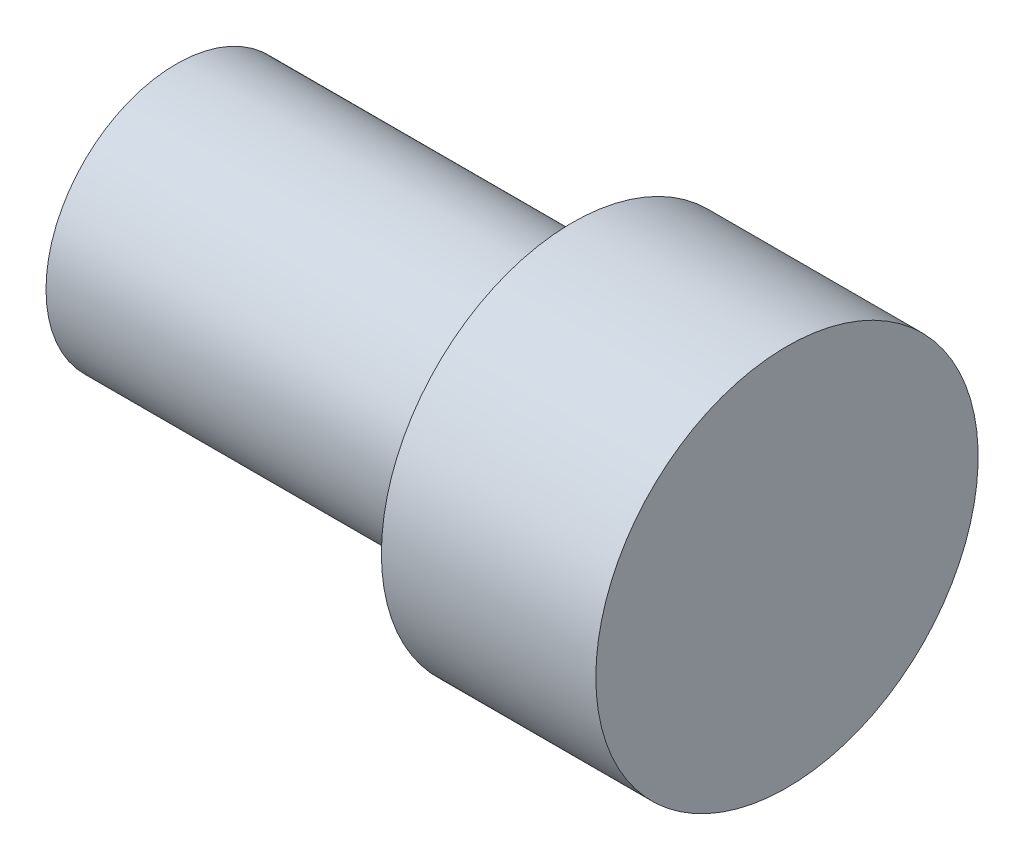
ISO-10303-21;
HEADER;
FILE_DESCRIPTION(('STEP AP214'),'2;1');
FILE_NAME('part.step','',(''),(''),'','','');
FILE_SCHEMA(('AUTOMOTIVE_DESIGN { 1 0 10303 214 1 1 1 1 }'));
ENDSEC;
DATA;
#1=APPLICATION_CONTEXT('core data for automotive mechanical design processes');
#2=APPLICATION_PROTOCOL_DEFINITION('international standard','automotive_design',2000,#1);
#3=PRODUCT_CONTEXT('',#1,'mechanical');
#4=PRODUCT('Part','Part','',(#3));
#5=PRODUCT_RELATED_PRODUCT_CATEGORY('part','',(#4));
#6=PRODUCT_DEFINITION_FORMATION('','',#4);
#7=PRODUCT_DEFINITION_CONTEXT('part definition',#1,'design');
#8=PRODUCT_DEFINITION('design','',#6,#7);
#9=PRODUCT_DEFINITION_SHAPE('','',#8);
#10=(LENGTH_UNIT() NAMED_UNIT(*) SI_UNIT(.MILLI.,.METRE.));
#11=(NAMED_UNIT(*) PLANE_ANGLE_UNIT() SI_UNIT($,.RADIAN.));
#12=(NAMED_UNIT(*) SI_UNIT($,.STERADIAN.) SOLID_ANGLE_UNIT());
#13=UNCERTAINTY_MEASURE_WITH_UNIT(LENGTH_MEASURE(1.E-05),#10,'distance_accuracy_value','');
#14=(GEOMETRIC_REPRESENTATION_CONTEXT(3) GLOBAL_UNCERTAINTY_ASSIGNED_CONTEXT((#13)) GLOBAL_UNIT_ASSIGNED_CONTEXT((#10,
#11,#12)) REPRESENTATION_CONTEXT('',''));
#15=CARTESIAN_POINT('',(0.,0.,0.));
#16=DIRECTION('',(0.,0.,1.));
#17=DIRECTION('',(1.,0.,0.));
#18=AXIS2_PLACEMENT_3D('',#15,#16,#17);
#19=CARTESIAN_POINT('',(-65.9159494636814,0.,0.));
#20=DIRECTION('',(1.,0.,0.));
#21=DIRECTION('',(0.,0.,-1.));
#22=AXIS2_PLACEMENT_3D('',#19,#20,#21);
#23=PLANE('',#22);
#24=CARTESIAN_POINT('',(-65.9159494636814,0.,0.));
#25=DIRECTION('',(-1.,0.,0.));
#26=DIRECTION('',(0.,0.,1.));
#27=AXIS2_PLACEMENT_3D('',#24,#25,#26);
#28=CIRCLE('',#27,28.0596335331635);
#29=CARTESIAN_POINT('',(-65.9159494636814,0.,28.0596335331635));
#30=VERTEX_POINT('',#29);
#31=EDGE_CURVE('E10',#30,#30,#28,.T.);
#32=ORIENTED_EDGE('',*,*,#31,.T.);
#33=EDGE_LOOP('',(#32));
#34=FACE_BOUND('',#33,.T.);
#35=ADVANCED_FACE('F33',(#34),#23,.F.);
#36=CARTESIAN_POINT('',(-65.9159494636814,0.,0.));
#37=DIRECTION('',(-1.,0.,0.));
#38=DIRECTION('',(0.,0.,1.));
#39=AXIS2_PLACEMENT_3D('',#36,#37,#38);
#40=CYLINDRICAL_SURFACE('',#39,28.0596335331635);
#41=ORIENTED_EDGE('',*,*,#31,.F.);
#42=EDGE_LOOP('',(#41));
#43=FACE_BOUND('',#42,.T.);
#44=CARTESIAN_POINT('',(19.4724180984454,0.,0.));
#45=DIRECTION('',(-1.,0.,0.));
#46=DIRECTION('',(0.,0.,1.));
#47=AXIS2_PLACEMENT_3D('',#44,#45,#46);
#48=CIRCLE('',#47,28.0596335331635);
#49=CARTESIAN_POINT('',(19.4724180984454,0.,28.0596335331635));
#50=VERTEX_POINT('',#49);
#51=EDGE_CURVE('E39',#50,#50,#48,.T.);
#52=ORIENTED_EDGE('',*,*,#51,.T.);
#53=EDGE_LOOP('',(#52));
#54=FACE_BOUND('',#53,.T.);
#55=ADVANCED_FACE('F65',(#43,#54),#40,.T.);
#56=CARTESIAN_POINT('',(19.4724180984454,28.0596335331635,0.));
#57=DIRECTION('',(1.,0.,0.));
#58=DIRECTION('',(0.,0.,-1.));
#59=AXIS2_PLACEMENT_3D('',#56,#57,#58);
#60=PLANE('',#59);
#61=ORIENTED_EDGE('',*,*,#51,.F.);
#62=EDGE_LOOP('',(#61));
#63=FACE_BOUND('',#62,.T.);
#64=CARTESIAN_POINT('',(19.4724180984454,0.,0.));
#65=DIRECTION('',(-1.,0.,0.));
#66=DIRECTION('',(0.,0.,1.));
#67=AXIS2_PLACEMENT_3D('',#64,#65,#66);
#68=CIRCLE('',#67,41.1886232928964);
#69=CARTESIAN_POINT('',(19.4724180984454,0.,41.1886232928964));
#70=VERTEX_POINT('',#69);
#71=EDGE_CURVE('E43',#70,#70,#68,.T.);
#72=ORIENTED_EDGE('',*,*,#71,.T.);
#73=EDGE_LOOP('',(#72));
#74=FACE_BOUND('',#73,.T.);
#75=ADVANCED_FACE('F61',(#63,#74),#60,.F.);
#76=CARTESIAN_POINT('',(-65.9159494636814,0.,0.));
#77=DIRECTION('',(-1.,0.,0.));
#78=DIRECTION('',(0.,0.,1.));
#79=AXIS2_PLACEMENT_3D('',#76,#77,#78);
#80=CYLINDRICAL_SURFACE('',#79,41.1886232928964);
#81=ORIENTED_EDGE('',*,*,#71,.F.);
#82=EDGE_LOOP('',(#81));
#83=FACE_BOUND('',#82,.T.);
#84=CARTESIAN_POINT('',(65.6740560711542,0.,0.));
#85=DIRECTION('',(-1.,0.,0.));
#86=DIRECTION('',(0.,0.,1.));
#87=AXIS2_PLACEMENT_3D('',#84,#85,#86);
#88=CIRCLE('',#87,41.1886232928964);
#89=CARTESIAN_POINT('',(65.6740560711542,0.,41.1886232928964));
#90=VERTEX_POINT('',#89);
#91=EDGE_CURVE('E47',#90,#90,#88,.T.);
#92=ORIENTED_EDGE('',*,*,#91,.T.);
#93=EDGE_LOOP('',(#92));
#94=FACE_BOUND('',#93,.T.);
#95=ADVANCED_FACE('F53',(#83,#94),#80,.T.);
#96=CARTESIAN_POINT('',(65.6740560711542,41.1886232928964,0.));
#97=DIRECTION('',(-1.,0.,0.));
#98=DIRECTION('',(0.,0.,1.));
#99=AXIS2_PLACEMENT_3D('',#96,#97,#98);
#100=PLANE('',#99);
#101=ORIENTED_EDGE('',*,*,#91,.F.);
#102=EDGE_LOOP('',(#101));
#103=FACE_BOUND('',#102,.T.);
#104=ADVANCED_FACE('F55',(#103),#100,.F.);
#105=CLOSED_SHELL('',(#35,#55,#75,#95,#104));
#106=MANIFOLD_SOLID_BREP('B2',#105);
#107=ADVANCED_BREP_SHAPE_REPRESENTATION('',(#18,#106),#14);
#108=SHAPE_DEFINITION_REPRESENTATION(#9,#107);
ENDSEC;
END-ISO-10303-21;
